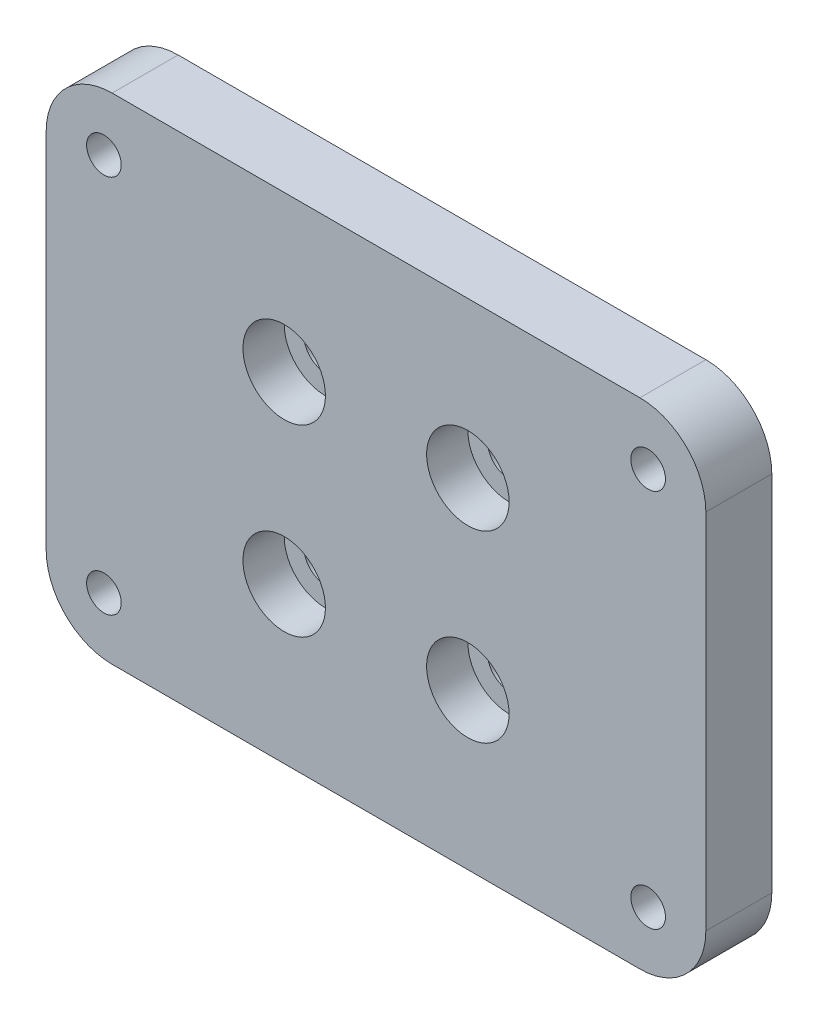
ISO-10303-21;
HEADER;
FILE_DESCRIPTION(('STEP AP214'),'2;1');
FILE_NAME('part.step','',(''),(''),'','','');
FILE_SCHEMA(('AUTOMOTIVE_DESIGN { 1 0 10303 214 1 1 1 1 }'));
ENDSEC;
DATA;
#1=APPLICATION_CONTEXT('core data for automotive mechanical design processes');
#2=APPLICATION_PROTOCOL_DEFINITION('international standard','automotive_design',2000,#1);
#3=PRODUCT_CONTEXT('',#1,'mechanical');
#4=PRODUCT('Part','Part','',(#3));
#5=PRODUCT_RELATED_PRODUCT_CATEGORY('part','',(#4));
#6=PRODUCT_DEFINITION_FORMATION('','',#4);
#7=PRODUCT_DEFINITION_CONTEXT('part definition',#1,'design');
#8=PRODUCT_DEFINITION('design','',#6,#7);
#9=PRODUCT_DEFINITION_SHAPE('','',#8);
#10=(LENGTH_UNIT() NAMED_UNIT(*) SI_UNIT(.MILLI.,.METRE.));
#11=(NAMED_UNIT(*) PLANE_ANGLE_UNIT() SI_UNIT($,.RADIAN.));
#12=(NAMED_UNIT(*) SI_UNIT($,.STERADIAN.) SOLID_ANGLE_UNIT());
#13=UNCERTAINTY_MEASURE_WITH_UNIT(LENGTH_MEASURE(1.E-05),#10,'distance_accuracy_value','');
#14=(GEOMETRIC_REPRESENTATION_CONTEXT(3) GLOBAL_UNCERTAINTY_ASSIGNED_CONTEXT((#13)) GLOBAL_UNIT_ASSIGNED_CONTEXT((#10,
#11,#12)) REPRESENTATION_CONTEXT('',''));
#15=CARTESIAN_POINT('',(0.,0.,0.));
#16=DIRECTION('',(0.,0.,1.));
#17=DIRECTION('',(1.,0.,0.));
#18=AXIS2_PLACEMENT_3D('',#15,#16,#17);
#19=CARTESIAN_POINT('',(51.1369318036884,18.8630681963121,-2.));
#20=DIRECTION('',(0.,0.,1.));
#21=DIRECTION('',(1.,0.,0.));
#22=AXIS2_PLACEMENT_3D('',#19,#20,#21);
#23=CYLINDRICAL_SURFACE('',#22,2.6);
#24=CARTESIAN_POINT('',(51.1369318036884,18.8630681963121,0.));
#25=DIRECTION('',(0.,0.,-1.));
#26=DIRECTION('',(-1.,0.,0.));
#27=AXIS2_PLACEMENT_3D('',#24,#25,#26);
#28=CIRCLE('',#27,2.6);
#29=CARTESIAN_POINT('',(48.5369318036884,18.8630681963121,0.));
#30=VERTEX_POINT('',#29);
#31=EDGE_CURVE('E149',#30,#30,#28,.T.);
#32=ORIENTED_EDGE('',*,*,#31,.T.);
#33=EDGE_LOOP('',(#32));
#34=FACE_BOUND('',#33,.T.);
#35=CARTESIAN_POINT('',(51.1369318036884,18.8630681963121,3.));
#36=DIRECTION('',(0.,0.,1.));
#37=DIRECTION('',(1.,0.,0.));
#38=AXIS2_PLACEMENT_3D('',#35,#36,#37);
#39=CIRCLE('',#38,2.6);
#40=CARTESIAN_POINT('',(53.7369318036884,18.8630681963121,3.));
#41=VERTEX_POINT('',#40);
#42=EDGE_CURVE('E192',#41,#41,#39,.F.);
#43=ORIENTED_EDGE('',*,*,#42,.F.);
#44=EDGE_LOOP('',(#43));
#45=FACE_BOUND('',#44,.T.);
#46=ADVANCED_FACE('F37',(#34,#45),#23,.F.);
#47=CARTESIAN_POINT('',(28.8630681963121,18.863068196312,-2.));
#48=DIRECTION('',(0.,0.,1.));
#49=DIRECTION('',(1.,0.,0.));
#50=AXIS2_PLACEMENT_3D('',#47,#48,#49);
#51=CYLINDRICAL_SURFACE('',#50,2.6);
#52=CARTESIAN_POINT('',(28.8630681963121,18.863068196312,0.));
#53=DIRECTION('',(0.,0.,-1.));
#54=DIRECTION('',(-1.,0.,0.));
#55=AXIS2_PLACEMENT_3D('',#52,#53,#54);
#56=CIRCLE('',#55,2.6);
#57=CARTESIAN_POINT('',(26.2630681963121,18.863068196312,0.));
#58=VERTEX_POINT('',#57);
#59=EDGE_CURVE('E152',#58,#58,#56,.T.);
#60=ORIENTED_EDGE('',*,*,#59,.T.);
#61=EDGE_LOOP('',(#60));
#62=FACE_BOUND('',#61,.T.);
#63=CARTESIAN_POINT('',(28.8630681963121,18.863068196312,3.));
#64=DIRECTION('',(0.,0.,1.));
#65=DIRECTION('',(1.,0.,0.));
#66=AXIS2_PLACEMENT_3D('',#63,#64,#65);
#67=CIRCLE('',#66,2.6);
#68=CARTESIAN_POINT('',(31.4630681963121,18.863068196312,3.));
#69=VERTEX_POINT('',#68);
#70=EDGE_CURVE('E187',#69,#69,#67,.F.);
#71=ORIENTED_EDGE('',*,*,#70,.F.);
#72=EDGE_LOOP('',(#71));
#73=FACE_BOUND('',#72,.T.);
#74=ADVANCED_FACE('F273',(#62,#73),#51,.F.);
#75=CARTESIAN_POINT('',(51.1369318036882,41.1369318036884,-2.));
#76=DIRECTION('',(0.,0.,1.));
#77=DIRECTION('',(1.,0.,0.));
#78=AXIS2_PLACEMENT_3D('',#75,#76,#77);
#79=CYLINDRICAL_SURFACE('',#78,2.6);
#80=CARTESIAN_POINT('',(51.1369318036882,41.1369318036884,0.));
#81=DIRECTION('',(0.,0.,-1.));
#82=DIRECTION('',(-1.,0.,0.));
#83=AXIS2_PLACEMENT_3D('',#80,#81,#82);
#84=CIRCLE('',#83,2.6);
#85=CARTESIAN_POINT('',(48.5369318036882,41.1369318036884,0.));
#86=VERTEX_POINT('',#85);
#87=EDGE_CURVE('E146',#86,#86,#84,.T.);
#88=ORIENTED_EDGE('',*,*,#87,.T.);
#89=EDGE_LOOP('',(#88));
#90=FACE_BOUND('',#89,.T.);
#91=CARTESIAN_POINT('',(51.1369318036882,41.1369318036884,3.));
#92=DIRECTION('',(0.,0.,1.));
#93=DIRECTION('',(1.,0.,0.));
#94=AXIS2_PLACEMENT_3D('',#91,#92,#93);
#95=CIRCLE('',#94,2.6);
#96=CARTESIAN_POINT('',(53.7369318036882,41.1369318036884,3.));
#97=VERTEX_POINT('',#96);
#98=EDGE_CURVE('E182',#97,#97,#95,.F.);
#99=ORIENTED_EDGE('',*,*,#98,.F.);
#100=EDGE_LOOP('',(#99));
#101=FACE_BOUND('',#100,.T.);
#102=ADVANCED_FACE('F279',(#90,#101),#79,.F.);
#103=CARTESIAN_POINT('',(28.8630681963119,41.1369318036881,-2.));
#104=DIRECTION('',(0.,0.,1.));
#105=DIRECTION('',(1.,0.,0.));
#106=AXIS2_PLACEMENT_3D('',#103,#104,#105);
#107=CYLINDRICAL_SURFACE('',#106,2.6);
#108=CARTESIAN_POINT('',(28.8630681963119,41.1369318036881,0.));
#109=DIRECTION('',(0.,0.,-1.));
#110=DIRECTION('',(-1.,0.,0.));
#111=AXIS2_PLACEMENT_3D('',#108,#109,#110);
#112=CIRCLE('',#111,2.6);
#113=CARTESIAN_POINT('',(26.2630681963119,41.1369318036881,0.));
#114=VERTEX_POINT('',#113);
#115=EDGE_CURVE('E137',#114,#114,#112,.T.);
#116=ORIENTED_EDGE('',*,*,#115,.T.);
#117=EDGE_LOOP('',(#116));
#118=FACE_BOUND('',#117,.T.);
#119=CARTESIAN_POINT('',(28.8630681963119,41.1369318036881,3.));
#120=DIRECTION('',(0.,0.,1.));
#121=DIRECTION('',(1.,0.,0.));
#122=AXIS2_PLACEMENT_3D('',#119,#120,#121);
#123=CIRCLE('',#122,2.6);
#124=CARTESIAN_POINT('',(31.4630681963119,41.1369318036881,3.));
#125=VERTEX_POINT('',#124);
#126=EDGE_CURVE('E155',#125,#125,#123,.F.);
#127=ORIENTED_EDGE('',*,*,#126,.F.);
#128=EDGE_LOOP('',(#127));
#129=FACE_BOUND('',#128,.T.);
#130=ADVANCED_FACE('F287',(#118,#129),#107,.F.);
#131=CARTESIAN_POINT('',(0.,0.,8.));
#132=DIRECTION('',(1.,0.,0.));
#133=DIRECTION('',(0.,0.,-1.));
#134=AXIS2_PLACEMENT_3D('',#131,#132,#133);
#135=PLANE('',#134);
#136=DIRECTION('',(0.,-1.,0.));
#137=VECTOR('',#136,1.);
#138=CARTESIAN_POINT('',(0.,0.,0.));
#139=LINE('',#138,#137);
#140=CARTESIAN_POINT('',(0.,52.,0.));
#141=VERTEX_POINT('',#140);
#142=CARTESIAN_POINT('',(0.,8.,0.));
#143=VERTEX_POINT('',#142);
#144=EDGE_CURVE('E132',#141,#143,#139,.T.);
#145=ORIENTED_EDGE('',*,*,#144,.T.);
#146=DIRECTION('',(0.,0.,-1.));
#147=VECTOR('',#146,1.);
#148=CARTESIAN_POINT('',(0.,8.,8.));
#149=LINE('',#148,#147);
#150=CARTESIAN_POINT('',(0.,8.,8.));
#151=VERTEX_POINT('',#150);
#152=EDGE_CURVE('E110',#143,#151,#149,.F.);
#153=ORIENTED_EDGE('',*,*,#152,.T.);
#154=DIRECTION('',(0.,-1.,0.));
#155=VECTOR('',#154,1.);
#156=CARTESIAN_POINT('',(0.,0.,8.));
#157=LINE('',#156,#155);
#158=CARTESIAN_POINT('',(0.,52.,8.));
#159=VERTEX_POINT('',#158);
#160=EDGE_CURVE('E142',#159,#151,#157,.T.);
#161=ORIENTED_EDGE('',*,*,#160,.F.);
#162=DIRECTION('',(0.,0.,-1.));
#163=VECTOR('',#162,1.);
#164=CARTESIAN_POINT('',(0.,52.,8.));
#165=LINE('',#164,#163);
#166=EDGE_CURVE('E115',#159,#141,#165,.T.);
#167=ORIENTED_EDGE('',*,*,#166,.T.);
#168=EDGE_LOOP('',(#145,#153,#161,#167));
#169=FACE_BOUND('',#168,.T.);
#170=ADVANCED_FACE('F252',(#169),#135,.F.);
#171=CARTESIAN_POINT('',(0.,0.,8.));
#172=DIRECTION('',(0.,1.,0.));
#173=DIRECTION('',(0.,0.,1.));
#174=AXIS2_PLACEMENT_3D('',#171,#172,#173);
#175=PLANE('',#174);
#176=DIRECTION('',(1.,0.,0.));
#177=VECTOR('',#176,1.);
#178=CARTESIAN_POINT('',(0.,0.,8.));
#179=LINE('',#178,#177);
#180=CARTESIAN_POINT('',(8.,0.,8.));
#181=VERTEX_POINT('',#180);
#182=CARTESIAN_POINT('',(72.,0.,8.));
#183=VERTEX_POINT('',#182);
#184=EDGE_CURVE('E125',#181,#183,#179,.T.);
#185=ORIENTED_EDGE('',*,*,#184,.F.);
#186=DIRECTION('',(0.,0.,-1.));
#187=VECTOR('',#186,1.);
#188=CARTESIAN_POINT('',(8.,0.,8.));
#189=LINE('',#188,#187);
#190=CARTESIAN_POINT('',(8.,0.,0.));
#191=VERTEX_POINT('',#190);
#192=EDGE_CURVE('E109',#181,#191,#189,.T.);
#193=ORIENTED_EDGE('',*,*,#192,.T.);
#194=DIRECTION('',(1.,0.,0.));
#195=VECTOR('',#194,1.);
#196=CARTESIAN_POINT('',(0.,0.,0.));
#197=LINE('',#196,#195);
#198=CARTESIAN_POINT('',(72.,0.,0.));
#199=VERTEX_POINT('',#198);
#200=EDGE_CURVE('E122',#191,#199,#197,.T.);
#201=ORIENTED_EDGE('',*,*,#200,.T.);
#202=DIRECTION('',(0.,0.,-1.));
#203=VECTOR('',#202,1.);
#204=CARTESIAN_POINT('',(72.,0.,8.));
#205=LINE('',#204,#203);
#206=EDGE_CURVE('E127',#199,#183,#205,.F.);
#207=ORIENTED_EDGE('',*,*,#206,.T.);
#208=EDGE_LOOP('',(#185,#193,#201,#207));
#209=FACE_BOUND('',#208,.T.);
#210=ADVANCED_FACE('F121',(#209),#175,.F.);
#211=CARTESIAN_POINT('',(80.,0.,8.));
#212=DIRECTION('',(-1.,0.,0.));
#213=DIRECTION('',(0.,0.,1.));
#214=AXIS2_PLACEMENT_3D('',#211,#212,#213);
#215=PLANE('',#214);
#216=DIRECTION('',(0.,1.,0.));
#217=VECTOR('',#216,1.);
#218=CARTESIAN_POINT('',(80.,0.,8.));
#219=LINE('',#218,#217);
#220=CARTESIAN_POINT('',(80.,8.,8.));
#221=VERTEX_POINT('',#220);
#222=CARTESIAN_POINT('',(80.,52.,8.));
#223=VERTEX_POINT('',#222);
#224=EDGE_CURVE('E243',#221,#223,#219,.T.);
#225=ORIENTED_EDGE('',*,*,#224,.F.);
#226=DIRECTION('',(0.,0.,-1.));
#227=VECTOR('',#226,1.);
#228=CARTESIAN_POINT('',(80.,8.,8.));
#229=LINE('',#228,#227);
#230=CARTESIAN_POINT('',(80.,8.,0.));
#231=VERTEX_POINT('',#230);
#232=EDGE_CURVE('E174',#221,#231,#229,.T.);
#233=ORIENTED_EDGE('',*,*,#232,.T.);
#234=DIRECTION('',(0.,1.,0.));
#235=VECTOR('',#234,1.);
#236=CARTESIAN_POINT('',(80.,0.,0.));
#237=LINE('',#236,#235);
#238=CARTESIAN_POINT('',(80.,52.,0.));
#239=VERTEX_POINT('',#238);
#240=EDGE_CURVE('E131',#231,#239,#237,.T.);
#241=ORIENTED_EDGE('',*,*,#240,.T.);
#242=DIRECTION('',(0.,0.,-1.));
#243=VECTOR('',#242,1.);
#244=CARTESIAN_POINT('',(80.,52.,8.));
#245=LINE('',#244,#243);
#246=EDGE_CURVE('E172',#239,#223,#245,.F.);
#247=ORIENTED_EDGE('',*,*,#246,.T.);
#248=EDGE_LOOP('',(#225,#233,#241,#247));
#249=FACE_BOUND('',#248,.T.);
#250=ADVANCED_FACE('F260',(#249),#215,.F.);
#251=CARTESIAN_POINT('',(0.,60.,8.));
#252=DIRECTION('',(0.,-1.,0.));
#253=DIRECTION('',(0.,0.,-1.));
#254=AXIS2_PLACEMENT_3D('',#251,#252,#253);
#255=PLANE('',#254);
#256=DIRECTION('',(-1.,0.,0.));
#257=VECTOR('',#256,1.);
#258=CARTESIAN_POINT('',(0.,60.,8.));
#259=LINE('',#258,#257);
#260=CARTESIAN_POINT('',(72.,60.,8.));
#261=VERTEX_POINT('',#260);
#262=CARTESIAN_POINT('',(8.,60.,8.));
#263=VERTEX_POINT('',#262);
#264=EDGE_CURVE('E156',#261,#263,#259,.T.);
#265=ORIENTED_EDGE('',*,*,#264,.F.);
#266=DIRECTION('',(0.,0.,-1.));
#267=VECTOR('',#266,1.);
#268=CARTESIAN_POINT('',(72.,60.,8.));
#269=LINE('',#268,#267);
#270=CARTESIAN_POINT('',(72.,60.,0.));
#271=VERTEX_POINT('',#270);
#272=EDGE_CURVE('E11',#261,#271,#269,.T.);
#273=ORIENTED_EDGE('',*,*,#272,.T.);
#274=DIRECTION('',(-1.,0.,0.));
#275=VECTOR('',#274,1.);
#276=CARTESIAN_POINT('',(0.,60.,0.));
#277=LINE('',#276,#275);
#278=CARTESIAN_POINT('',(8.,60.,0.));
#279=VERTEX_POINT('',#278);
#280=EDGE_CURVE('E135',#271,#279,#277,.T.);
#281=ORIENTED_EDGE('',*,*,#280,.T.);
#282=DIRECTION('',(0.,0.,-1.));
#283=VECTOR('',#282,1.);
#284=CARTESIAN_POINT('',(8.,60.,8.));
#285=LINE('',#284,#283);
#286=EDGE_CURVE('E46',#279,#263,#285,.F.);
#287=ORIENTED_EDGE('',*,*,#286,.T.);
#288=EDGE_LOOP('',(#265,#273,#281,#287));
#289=FACE_BOUND('',#288,.T.);
#290=ADVANCED_FACE('F254',(#289),#255,.F.);
#291=CARTESIAN_POINT('',(0.,60.,8.));
#292=DIRECTION('',(0.,0.,-1.));
#293=DIRECTION('',(-1.,0.,0.));
#294=AXIS2_PLACEMENT_3D('',#291,#292,#293);
#295=PLANE('',#294);
#296=CARTESIAN_POINT('',(7.00000000000001,6.99999999999999,8.));
#297=DIRECTION('',(0.,0.,1.));
#298=DIRECTION('',(1.,0.,0.));
#299=AXIS2_PLACEMENT_3D('',#296,#297,#298);
#300=CIRCLE('',#299,2.1);
#301=CARTESIAN_POINT('',(9.10000000000001,6.99999999999999,8.));
#302=VERTEX_POINT('',#301);
#303=EDGE_CURVE('E217',#302,#302,#300,.T.);
#304=ORIENTED_EDGE('',*,*,#303,.F.);
#305=EDGE_LOOP('',(#304));
#306=FACE_BOUND('',#305,.T.);
#307=CARTESIAN_POINT('',(73.,7.,8.));
#308=DIRECTION('',(0.,0.,1.));
#309=DIRECTION('',(1.,0.,0.));
#310=AXIS2_PLACEMENT_3D('',#307,#308,#309);
#311=CIRCLE('',#310,2.1);
#312=CARTESIAN_POINT('',(75.1,7.,8.));
#313=VERTEX_POINT('',#312);
#314=EDGE_CURVE('E207',#313,#313,#311,.T.);
#315=ORIENTED_EDGE('',*,*,#314,.F.);
#316=EDGE_LOOP('',(#315));
#317=FACE_BOUND('',#316,.T.);
#318=CARTESIAN_POINT('',(73.,53.,8.));
#319=DIRECTION('',(0.,0.,1.));
#320=DIRECTION('',(1.,0.,0.));
#321=AXIS2_PLACEMENT_3D('',#318,#319,#320);
#322=CIRCLE('',#321,2.1);
#323=CARTESIAN_POINT('',(75.1,53.,8.));
#324=VERTEX_POINT('',#323);
#325=EDGE_CURVE('E204',#324,#324,#322,.T.);
#326=ORIENTED_EDGE('',*,*,#325,.F.);
#327=EDGE_LOOP('',(#326));
#328=FACE_BOUND('',#327,.T.);
#329=CARTESIAN_POINT('',(7.00000000000001,53.,8.));
#330=DIRECTION('',(0.,0.,1.));
#331=DIRECTION('',(1.,0.,0.));
#332=AXIS2_PLACEMENT_3D('',#329,#330,#331);
#333=CIRCLE('',#332,2.1);
#334=CARTESIAN_POINT('',(9.1,53.,8.));
#335=VERTEX_POINT('',#334);
#336=EDGE_CURVE('E201',#335,#335,#333,.T.);
#337=ORIENTED_EDGE('',*,*,#336,.F.);
#338=EDGE_LOOP('',(#337));
#339=FACE_BOUND('',#338,.T.);
#340=CARTESIAN_POINT('',(51.1369318036884,18.8630681963121,8.));
#341=DIRECTION('',(0.,0.,1.));
#342=DIRECTION('',(1.,0.,0.));
#343=AXIS2_PLACEMENT_3D('',#340,#341,#342);
#344=CIRCLE('',#343,5.);
#345=CARTESIAN_POINT('',(56.1369318036884,18.8630681963121,8.));
#346=VERTEX_POINT('',#345);
#347=EDGE_CURVE('E200',#346,#346,#344,.T.);
#348=ORIENTED_EDGE('',*,*,#347,.F.);
#349=EDGE_LOOP('',(#348));
#350=FACE_BOUND('',#349,.T.);
#351=CARTESIAN_POINT('',(28.8630681963121,18.863068196312,8.));
#352=DIRECTION('',(0.,0.,1.));
#353=DIRECTION('',(1.,0.,0.));
#354=AXIS2_PLACEMENT_3D('',#351,#352,#353);
#355=CIRCLE('',#354,5.);
#356=CARTESIAN_POINT('',(33.8630681963121,18.863068196312,8.));
#357=VERTEX_POINT('',#356);
#358=EDGE_CURVE('E195',#357,#357,#355,.T.);
#359=ORIENTED_EDGE('',*,*,#358,.F.);
#360=EDGE_LOOP('',(#359));
#361=FACE_BOUND('',#360,.T.);
#362=CARTESIAN_POINT('',(51.1369318036882,41.1369318036884,8.));
#363=DIRECTION('',(0.,0.,1.));
#364=DIRECTION('',(1.,0.,0.));
#365=AXIS2_PLACEMENT_3D('',#362,#363,#364);
#366=CIRCLE('',#365,5.);
#367=CARTESIAN_POINT('',(56.1369318036882,41.1369318036884,8.));
#368=VERTEX_POINT('',#367);
#369=EDGE_CURVE('E190',#368,#368,#366,.T.);
#370=ORIENTED_EDGE('',*,*,#369,.F.);
#371=EDGE_LOOP('',(#370));
#372=FACE_BOUND('',#371,.T.);
#373=CARTESIAN_POINT('',(28.8630681963119,41.1369318036881,8.));
#374=DIRECTION('',(0.,0.,1.));
#375=DIRECTION('',(1.,0.,0.));
#376=AXIS2_PLACEMENT_3D('',#373,#374,#375);
#377=CIRCLE('',#376,5.);
#378=CARTESIAN_POINT('',(33.8630681963119,41.1369318036881,8.));
#379=VERTEX_POINT('',#378);
#380=EDGE_CURVE('E185',#379,#379,#377,.T.);
#381=ORIENTED_EDGE('',*,*,#380,.F.);
#382=EDGE_LOOP('',(#381));
#383=FACE_BOUND('',#382,.T.);
#384=ORIENTED_EDGE('',*,*,#160,.T.);
#385=CARTESIAN_POINT('',(8.,8.,8.));
#386=DIRECTION('',(0.,0.,-1.));
#387=DIRECTION('',(-1.,0.,0.));
#388=AXIS2_PLACEMENT_3D('',#385,#386,#387);
#389=CIRCLE('',#388,8.);
#390=EDGE_CURVE('E170',#151,#181,#389,.F.);
#391=ORIENTED_EDGE('',*,*,#390,.T.);
#392=ORIENTED_EDGE('',*,*,#184,.T.);
#393=CARTESIAN_POINT('',(72.,8.,8.));
#394=DIRECTION('',(0.,0.,-1.));
#395=DIRECTION('',(-1.,0.,0.));
#396=AXIS2_PLACEMENT_3D('',#393,#394,#395);
#397=CIRCLE('',#396,8.);
#398=EDGE_CURVE('E168',#183,#221,#397,.F.);
#399=ORIENTED_EDGE('',*,*,#398,.T.);
#400=ORIENTED_EDGE('',*,*,#224,.T.);
#401=CARTESIAN_POINT('',(72.,52.,8.));
#402=DIRECTION('',(0.,0.,-1.));
#403=DIRECTION('',(-1.,0.,0.));
#404=AXIS2_PLACEMENT_3D('',#401,#402,#403);
#405=CIRCLE('',#404,8.);
#406=EDGE_CURVE('E60',#223,#261,#405,.F.);
#407=ORIENTED_EDGE('',*,*,#406,.T.);
#408=ORIENTED_EDGE('',*,*,#264,.T.);
#409=CARTESIAN_POINT('',(8.,52.,8.));
#410=DIRECTION('',(0.,0.,-1.));
#411=DIRECTION('',(-1.,0.,0.));
#412=AXIS2_PLACEMENT_3D('',#409,#410,#411);
#413=CIRCLE('',#412,8.);
#414=EDGE_CURVE('E165',#263,#159,#413,.F.);
#415=ORIENTED_EDGE('',*,*,#414,.T.);
#416=EDGE_LOOP('',(#384,#391,#392,#399,#400,#407,#408,#415));
#417=FACE_BOUND('',#416,.T.);
#418=ADVANCED_FACE('F246',(#306,#317,#328,#339,#350,#361,#372,#383,#417),#295,.F.);
#419=CARTESIAN_POINT('',(0.,60.,0.));
#420=DIRECTION('',(0.,0.,-1.));
#421=DIRECTION('',(-1.,0.,0.));
#422=AXIS2_PLACEMENT_3D('',#419,#420,#421);
#423=PLANE('',#422);
#424=CARTESIAN_POINT('',(7.00000000000001,6.99999999999999,0.));
#425=DIRECTION('',(0.,0.,-1.));
#426=DIRECTION('',(-1.,0.,0.));
#427=AXIS2_PLACEMENT_3D('',#424,#425,#426);
#428=CIRCLE('',#427,2.1);
#429=CARTESIAN_POINT('',(4.9,6.99999999999999,0.));
#430=VERTEX_POINT('',#429);
#431=EDGE_CURVE('E41',#430,#430,#428,.T.);
#432=ORIENTED_EDGE('',*,*,#431,.F.);
#433=EDGE_LOOP('',(#432));
#434=FACE_BOUND('',#433,.T.);
#435=CARTESIAN_POINT('',(73.,7.,0.));
#436=DIRECTION('',(0.,0.,-1.));
#437=DIRECTION('',(-1.,0.,0.));
#438=AXIS2_PLACEMENT_3D('',#435,#436,#437);
#439=CIRCLE('',#438,2.1);
#440=CARTESIAN_POINT('',(70.9,7.,0.));
#441=VERTEX_POINT('',#440);
#442=EDGE_CURVE('E205',#441,#441,#439,.T.);
#443=ORIENTED_EDGE('',*,*,#442,.F.);
#444=EDGE_LOOP('',(#443));
#445=FACE_BOUND('',#444,.T.);
#446=CARTESIAN_POINT('',(73.,53.,0.));
#447=DIRECTION('',(0.,0.,-1.));
#448=DIRECTION('',(-1.,0.,0.));
#449=AXIS2_PLACEMENT_3D('',#446,#447,#448);
#450=CIRCLE('',#449,2.1);
#451=CARTESIAN_POINT('',(70.9,53.,0.));
#452=VERTEX_POINT('',#451);
#453=EDGE_CURVE('E202',#452,#452,#450,.T.);
#454=ORIENTED_EDGE('',*,*,#453,.F.);
#455=EDGE_LOOP('',(#454));
#456=FACE_BOUND('',#455,.T.);
#457=CARTESIAN_POINT('',(7.00000000000001,53.,0.));
#458=DIRECTION('',(0.,0.,-1.));
#459=DIRECTION('',(-1.,0.,0.));
#460=AXIS2_PLACEMENT_3D('',#457,#458,#459);
#461=CIRCLE('',#460,2.1);
#462=CARTESIAN_POINT('',(4.90000000000001,53.,0.));
#463=VERTEX_POINT('',#462);
#464=EDGE_CURVE('E197',#463,#463,#461,.T.);
#465=ORIENTED_EDGE('',*,*,#464,.F.);
#466=EDGE_LOOP('',(#465));
#467=FACE_BOUND('',#466,.T.);
#468=ORIENTED_EDGE('',*,*,#59,.F.);
#469=EDGE_LOOP('',(#468));
#470=FACE_BOUND('',#469,.T.);
#471=ORIENTED_EDGE('',*,*,#31,.F.);
#472=EDGE_LOOP('',(#471));
#473=FACE_BOUND('',#472,.T.);
#474=ORIENTED_EDGE('',*,*,#87,.F.);
#475=EDGE_LOOP('',(#474));
#476=FACE_BOUND('',#475,.T.);
#477=ORIENTED_EDGE('',*,*,#115,.F.);
#478=EDGE_LOOP('',(#477));
#479=FACE_BOUND('',#478,.T.);
#480=ORIENTED_EDGE('',*,*,#200,.F.);
#481=CARTESIAN_POINT('',(8.,8.,0.));
#482=DIRECTION('',(0.,0.,-1.));
#483=DIRECTION('',(-1.,0.,0.));
#484=AXIS2_PLACEMENT_3D('',#481,#482,#483);
#485=CIRCLE('',#484,8.);
#486=EDGE_CURVE('E105',#191,#143,#485,.T.);
#487=ORIENTED_EDGE('',*,*,#486,.T.);
#488=ORIENTED_EDGE('',*,*,#144,.F.);
#489=CARTESIAN_POINT('',(8.,52.,0.));
#490=DIRECTION('',(0.,0.,-1.));
#491=DIRECTION('',(-1.,0.,0.));
#492=AXIS2_PLACEMENT_3D('',#489,#490,#491);
#493=CIRCLE('',#492,8.);
#494=EDGE_CURVE('E126',#141,#279,#493,.T.);
#495=ORIENTED_EDGE('',*,*,#494,.T.);
#496=ORIENTED_EDGE('',*,*,#280,.F.);
#497=CARTESIAN_POINT('',(72.,52.,0.));
#498=DIRECTION('',(0.,0.,-1.));
#499=DIRECTION('',(-1.,0.,0.));
#500=AXIS2_PLACEMENT_3D('',#497,#498,#499);
#501=CIRCLE('',#500,8.);
#502=EDGE_CURVE('E159',#271,#239,#501,.T.);
#503=ORIENTED_EDGE('',*,*,#502,.T.);
#504=ORIENTED_EDGE('',*,*,#240,.F.);
#505=CARTESIAN_POINT('',(72.,8.,0.));
#506=DIRECTION('',(0.,0.,-1.));
#507=DIRECTION('',(-1.,0.,0.));
#508=AXIS2_PLACEMENT_3D('',#505,#506,#507);
#509=CIRCLE('',#508,8.);
#510=EDGE_CURVE('E116',#231,#199,#509,.T.);
#511=ORIENTED_EDGE('',*,*,#510,.T.);
#512=EDGE_LOOP('',(#480,#487,#488,#495,#496,#503,#504,#511));
#513=FACE_BOUND('',#512,.T.);
#514=ADVANCED_FACE('F129',(#434,#445,#456,#467,#470,#473,#476,#479,#513),#423,.T.);
#515=CARTESIAN_POINT('',(8.,8.,8.));
#516=DIRECTION('',(0.,0.,-1.));
#517=DIRECTION('',(-1.,0.,0.));
#518=AXIS2_PLACEMENT_3D('',#515,#516,#517);
#519=CYLINDRICAL_SURFACE('',#518,8.);
#520=ORIENTED_EDGE('',*,*,#390,.F.);
#521=ORIENTED_EDGE('',*,*,#152,.F.);
#522=ORIENTED_EDGE('',*,*,#486,.F.);
#523=ORIENTED_EDGE('',*,*,#192,.F.);
#524=EDGE_LOOP('',(#520,#521,#522,#523));
#525=FACE_BOUND('',#524,.T.);
#526=ADVANCED_FACE('F108',(#525),#519,.T.);
#527=CARTESIAN_POINT('',(72.,8.,8.));
#528=DIRECTION('',(0.,0.,-1.));
#529=DIRECTION('',(-1.,0.,0.));
#530=AXIS2_PLACEMENT_3D('',#527,#528,#529);
#531=CYLINDRICAL_SURFACE('',#530,8.);
#532=ORIENTED_EDGE('',*,*,#398,.F.);
#533=ORIENTED_EDGE('',*,*,#206,.F.);
#534=ORIENTED_EDGE('',*,*,#510,.F.);
#535=ORIENTED_EDGE('',*,*,#232,.F.);
#536=EDGE_LOOP('',(#532,#533,#534,#535));
#537=FACE_BOUND('',#536,.T.);
#538=ADVANCED_FACE('F264',(#537),#531,.T.);
#539=CARTESIAN_POINT('',(72.,52.,8.));
#540=DIRECTION('',(0.,0.,-1.));
#541=DIRECTION('',(-1.,0.,0.));
#542=AXIS2_PLACEMENT_3D('',#539,#540,#541);
#543=CYLINDRICAL_SURFACE('',#542,8.);
#544=ORIENTED_EDGE('',*,*,#406,.F.);
#545=ORIENTED_EDGE('',*,*,#246,.F.);
#546=ORIENTED_EDGE('',*,*,#502,.F.);
#547=ORIENTED_EDGE('',*,*,#272,.F.);
#548=EDGE_LOOP('',(#544,#545,#546,#547));
#549=FACE_BOUND('',#548,.T.);
#550=ADVANCED_FACE('F256',(#549),#543,.T.);
#551=CARTESIAN_POINT('',(8.,52.,8.));
#552=DIRECTION('',(0.,0.,-1.));
#553=DIRECTION('',(-1.,0.,0.));
#554=AXIS2_PLACEMENT_3D('',#551,#552,#553);
#555=CYLINDRICAL_SURFACE('',#554,8.);
#556=ORIENTED_EDGE('',*,*,#414,.F.);
#557=ORIENTED_EDGE('',*,*,#286,.F.);
#558=ORIENTED_EDGE('',*,*,#494,.F.);
#559=ORIENTED_EDGE('',*,*,#166,.F.);
#560=EDGE_LOOP('',(#556,#557,#558,#559));
#561=FACE_BOUND('',#560,.T.);
#562=ADVANCED_FACE('F39',(#561),#555,.T.);
#563=CARTESIAN_POINT('',(28.8630681963119,41.1369318036881,3.));
#564=DIRECTION('',(0.,0.,1.));
#565=DIRECTION('',(1.,0.,0.));
#566=AXIS2_PLACEMENT_3D('',#563,#564,#565);
#567=PLANE('',#566);
#568=CARTESIAN_POINT('',(28.8630681963119,41.1369318036881,3.));
#569=DIRECTION('',(0.,0.,1.));
#570=DIRECTION('',(1.,0.,0.));
#571=AXIS2_PLACEMENT_3D('',#568,#569,#570);
#572=CIRCLE('',#571,5.);
#573=CARTESIAN_POINT('',(33.8630681963119,41.1369318036881,3.));
#574=VERTEX_POINT('',#573);
#575=EDGE_CURVE('E181',#574,#574,#572,.T.);
#576=ORIENTED_EDGE('',*,*,#575,.T.);
#577=EDGE_LOOP('',(#576));
#578=FACE_BOUND('',#577,.T.);
#579=ORIENTED_EDGE('',*,*,#126,.T.);
#580=EDGE_LOOP('',(#579));
#581=FACE_BOUND('',#580,.T.);
#582=ADVANCED_FACE('F352',(#578,#581),#567,.T.);
#583=CARTESIAN_POINT('',(28.8630681963119,41.1369318036881,3.));
#584=DIRECTION('',(0.,0.,1.));
#585=DIRECTION('',(1.,0.,0.));
#586=AXIS2_PLACEMENT_3D('',#583,#584,#585);
#587=CYLINDRICAL_SURFACE('',#586,5.);
#588=ORIENTED_EDGE('',*,*,#575,.F.);
#589=EDGE_LOOP('',(#588));
#590=FACE_BOUND('',#589,.T.);
#591=ORIENTED_EDGE('',*,*,#380,.T.);
#592=EDGE_LOOP('',(#591));
#593=FACE_BOUND('',#592,.T.);
#594=ADVANCED_FACE('F382',(#590,#593),#587,.F.);
#595=CARTESIAN_POINT('',(51.1369318036882,41.1369318036884,3.));
#596=DIRECTION('',(0.,0.,1.));
#597=DIRECTION('',(1.,0.,0.));
#598=AXIS2_PLACEMENT_3D('',#595,#596,#597);
#599=PLANE('',#598);
#600=CARTESIAN_POINT('',(51.1369318036882,41.1369318036884,3.));
#601=DIRECTION('',(0.,0.,1.));
#602=DIRECTION('',(1.,0.,0.));
#603=AXIS2_PLACEMENT_3D('',#600,#601,#602);
#604=CIRCLE('',#603,5.);
#605=CARTESIAN_POINT('',(56.1369318036882,41.1369318036884,3.));
#606=VERTEX_POINT('',#605);
#607=EDGE_CURVE('E186',#606,#606,#604,.T.);
#608=ORIENTED_EDGE('',*,*,#607,.T.);
#609=EDGE_LOOP('',(#608));
#610=FACE_BOUND('',#609,.T.);
#611=ORIENTED_EDGE('',*,*,#98,.T.);
#612=EDGE_LOOP('',(#611));
#613=FACE_BOUND('',#612,.T.);
#614=ADVANCED_FACE('F391',(#610,#613),#599,.T.);
#615=CARTESIAN_POINT('',(51.1369318036882,41.1369318036884,3.));
#616=DIRECTION('',(0.,0.,1.));
#617=DIRECTION('',(1.,0.,0.));
#618=AXIS2_PLACEMENT_3D('',#615,#616,#617);
#619=CYLINDRICAL_SURFACE('',#618,5.);
#620=ORIENTED_EDGE('',*,*,#607,.F.);
#621=EDGE_LOOP('',(#620));
#622=FACE_BOUND('',#621,.T.);
#623=ORIENTED_EDGE('',*,*,#369,.T.);
#624=EDGE_LOOP('',(#623));
#625=FACE_BOUND('',#624,.T.);
#626=ADVANCED_FACE('F399',(#622,#625),#619,.F.);
#627=CARTESIAN_POINT('',(28.8630681963121,18.863068196312,3.));
#628=DIRECTION('',(0.,0.,1.));
#629=DIRECTION('',(1.,0.,0.));
#630=AXIS2_PLACEMENT_3D('',#627,#628,#629);
#631=PLANE('',#630);
#632=CARTESIAN_POINT('',(28.8630681963121,18.863068196312,3.));
#633=DIRECTION('',(0.,0.,1.));
#634=DIRECTION('',(1.,0.,0.));
#635=AXIS2_PLACEMENT_3D('',#632,#633,#634);
#636=CIRCLE('',#635,5.);
#637=CARTESIAN_POINT('',(33.8630681963121,18.863068196312,3.));
#638=VERTEX_POINT('',#637);
#639=EDGE_CURVE('E191',#638,#638,#636,.T.);
#640=ORIENTED_EDGE('',*,*,#639,.T.);
#641=EDGE_LOOP('',(#640));
#642=FACE_BOUND('',#641,.T.);
#643=ORIENTED_EDGE('',*,*,#70,.T.);
#644=EDGE_LOOP('',(#643));
#645=FACE_BOUND('',#644,.T.);
#646=ADVANCED_FACE('F409',(#642,#645),#631,.T.);
#647=CARTESIAN_POINT('',(28.8630681963121,18.863068196312,3.));
#648=DIRECTION('',(0.,0.,1.));
#649=DIRECTION('',(1.,0.,0.));
#650=AXIS2_PLACEMENT_3D('',#647,#648,#649);
#651=CYLINDRICAL_SURFACE('',#650,5.);
#652=ORIENTED_EDGE('',*,*,#639,.F.);
#653=EDGE_LOOP('',(#652));
#654=FACE_BOUND('',#653,.T.);
#655=ORIENTED_EDGE('',*,*,#358,.T.);
#656=EDGE_LOOP('',(#655));
#657=FACE_BOUND('',#656,.T.);
#658=ADVANCED_FACE('F419',(#654,#657),#651,.F.);
#659=CARTESIAN_POINT('',(51.1369318036884,18.8630681963121,3.));
#660=DIRECTION('',(0.,0.,1.));
#661=DIRECTION('',(1.,0.,0.));
#662=AXIS2_PLACEMENT_3D('',#659,#660,#661);
#663=PLANE('',#662);
#664=CARTESIAN_POINT('',(51.1369318036884,18.8630681963121,3.));
#665=DIRECTION('',(0.,0.,1.));
#666=DIRECTION('',(1.,0.,0.));
#667=AXIS2_PLACEMENT_3D('',#664,#665,#666);
#668=CIRCLE('',#667,5.);
#669=CARTESIAN_POINT('',(56.1369318036884,18.8630681963121,3.));
#670=VERTEX_POINT('',#669);
#671=EDGE_CURVE('E196',#670,#670,#668,.T.);
#672=ORIENTED_EDGE('',*,*,#671,.T.);
#673=EDGE_LOOP('',(#672));
#674=FACE_BOUND('',#673,.T.);
#675=ORIENTED_EDGE('',*,*,#42,.T.);
#676=EDGE_LOOP('',(#675));
#677=FACE_BOUND('',#676,.T.);
#678=ADVANCED_FACE('F429',(#674,#677),#663,.T.);
#679=CARTESIAN_POINT('',(51.1369318036884,18.8630681963121,3.));
#680=DIRECTION('',(0.,0.,1.));
#681=DIRECTION('',(1.,0.,0.));
#682=AXIS2_PLACEMENT_3D('',#679,#680,#681);
#683=CYLINDRICAL_SURFACE('',#682,5.);
#684=ORIENTED_EDGE('',*,*,#671,.F.);
#685=EDGE_LOOP('',(#684));
#686=FACE_BOUND('',#685,.T.);
#687=ORIENTED_EDGE('',*,*,#347,.T.);
#688=EDGE_LOOP('',(#687));
#689=FACE_BOUND('',#688,.T.);
#690=ADVANCED_FACE('F439',(#686,#689),#683,.F.);
#691=CARTESIAN_POINT('',(7.00000000000001,53.,-2.));
#692=DIRECTION('',(0.,0.,1.));
#693=DIRECTION('',(1.,0.,0.));
#694=AXIS2_PLACEMENT_3D('',#691,#692,#693);
#695=CYLINDRICAL_SURFACE('',#694,2.1);
#696=ORIENTED_EDGE('',*,*,#464,.T.);
#697=EDGE_LOOP('',(#696));
#698=FACE_BOUND('',#697,.T.);
#699=ORIENTED_EDGE('',*,*,#336,.T.);
#700=EDGE_LOOP('',(#699));
#701=FACE_BOUND('',#700,.T.);
#702=ADVANCED_FACE('F448',(#698,#701),#695,.F.);
#703=CARTESIAN_POINT('',(73.,53.,-2.));
#704=DIRECTION('',(0.,0.,1.));
#705=DIRECTION('',(1.,0.,0.));
#706=AXIS2_PLACEMENT_3D('',#703,#704,#705);
#707=CYLINDRICAL_SURFACE('',#706,2.1);
#708=ORIENTED_EDGE('',*,*,#453,.T.);
#709=EDGE_LOOP('',(#708));
#710=FACE_BOUND('',#709,.T.);
#711=ORIENTED_EDGE('',*,*,#325,.T.);
#712=EDGE_LOOP('',(#711));
#713=FACE_BOUND('',#712,.T.);
#714=ADVANCED_FACE('F466',(#710,#713),#707,.F.);
#715=CARTESIAN_POINT('',(73.,7.,-2.));
#716=DIRECTION('',(0.,0.,1.));
#717=DIRECTION('',(1.,0.,0.));
#718=AXIS2_PLACEMENT_3D('',#715,#716,#717);
#719=CYLINDRICAL_SURFACE('',#718,2.1);
#720=ORIENTED_EDGE('',*,*,#442,.T.);
#721=EDGE_LOOP('',(#720));
#722=FACE_BOUND('',#721,.T.);
#723=ORIENTED_EDGE('',*,*,#314,.T.);
#724=EDGE_LOOP('',(#723));
#725=FACE_BOUND('',#724,.T.);
#726=ADVANCED_FACE('F476',(#722,#725),#719,.F.);
#727=CARTESIAN_POINT('',(7.00000000000001,6.99999999999999,-2.));
#728=DIRECTION('',(0.,0.,1.));
#729=DIRECTION('',(1.,0.,0.));
#730=AXIS2_PLACEMENT_3D('',#727,#728,#729);
#731=CYLINDRICAL_SURFACE('',#730,2.1);
#732=ORIENTED_EDGE('',*,*,#431,.T.);
#733=EDGE_LOOP('',(#732));
#734=FACE_BOUND('',#733,.T.);
#735=ORIENTED_EDGE('',*,*,#303,.T.);
#736=EDGE_LOOP('',(#735));
#737=FACE_BOUND('',#736,.T.);
#738=ADVANCED_FACE('F486',(#734,#737),#731,.F.);
#739=CLOSED_SHELL('',(#46,#74,#102,#130,#170,#210,#250,#290,#418,#514,#526,#538,#550,#562,#582,
#594,#614,#626,#646,#658,#678,#690,#702,#714,#726,#738));
#740=MANIFOLD_SOLID_BREP('B2',#739);
#741=ADVANCED_BREP_SHAPE_REPRESENTATION('',(#18,#740),#14);
#742=SHAPE_DEFINITION_REPRESENTATION(#9,#741);
ENDSEC;
END-ISO-10303-21;
